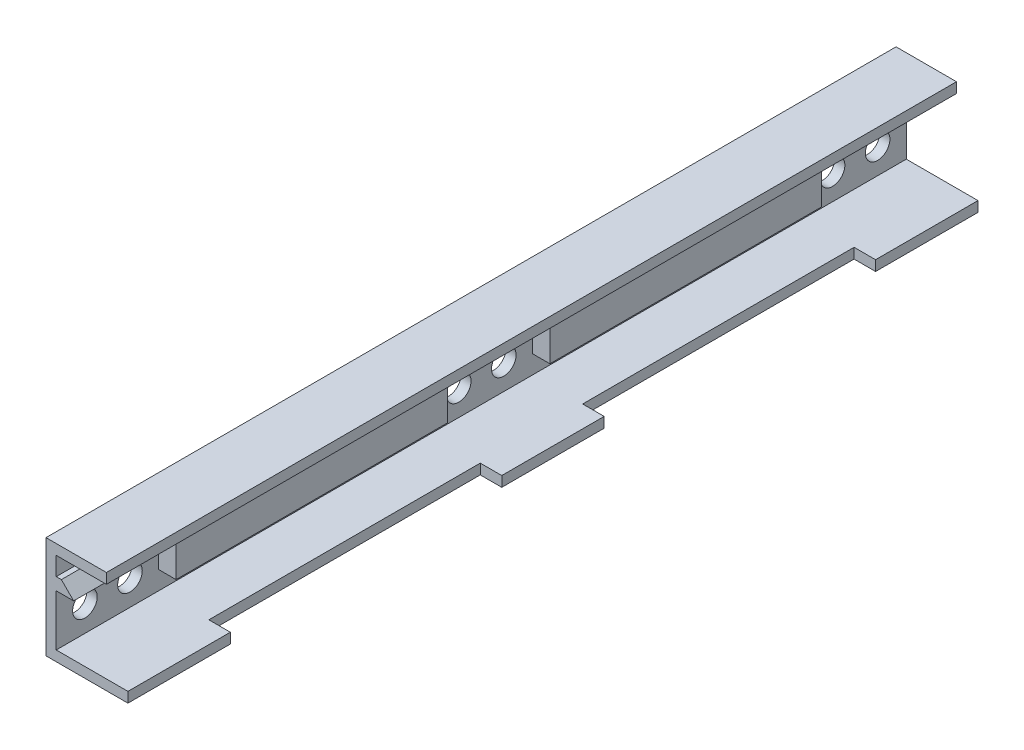
ISO-10303-21;
HEADER;
FILE_DESCRIPTION(('STEP AP214'),'2;1');
FILE_NAME('part.step','',(''),(''),'','','');
FILE_SCHEMA(('AUTOMOTIVE_DESIGN { 1 0 10303 214 1 1 1 1 }'));
ENDSEC;
DATA;
#1=APPLICATION_CONTEXT('core data for automotive mechanical design processes');
#2=APPLICATION_PROTOCOL_DEFINITION('international standard','automotive_design',2000,#1);
#3=PRODUCT_CONTEXT('',#1,'mechanical');
#4=PRODUCT('Part','Part','',(#3));
#5=PRODUCT_RELATED_PRODUCT_CATEGORY('part','',(#4));
#6=PRODUCT_DEFINITION_FORMATION('','',#4);
#7=PRODUCT_DEFINITION_CONTEXT('part definition',#1,'design');
#8=PRODUCT_DEFINITION('design','',#6,#7);
#9=PRODUCT_DEFINITION_SHAPE('','',#8);
#10=(LENGTH_UNIT() NAMED_UNIT(*) SI_UNIT(.MILLI.,.METRE.));
#11=(NAMED_UNIT(*) PLANE_ANGLE_UNIT() SI_UNIT($,.RADIAN.));
#12=(NAMED_UNIT(*) SI_UNIT($,.STERADIAN.) SOLID_ANGLE_UNIT());
#13=UNCERTAINTY_MEASURE_WITH_UNIT(LENGTH_MEASURE(1.E-05),#10,'distance_accuracy_value','');
#14=(GEOMETRIC_REPRESENTATION_CONTEXT(3) GLOBAL_UNCERTAINTY_ASSIGNED_CONTEXT((#13)) GLOBAL_UNIT_ASSIGNED_CONTEXT((#10,
#11,#12)) REPRESENTATION_CONTEXT('',''));
#15=CARTESIAN_POINT('',(0.,0.,0.));
#16=DIRECTION('',(0.,0.,1.));
#17=DIRECTION('',(1.,0.,0.));
#18=AXIS2_PLACEMENT_3D('',#15,#16,#17);
#19=CARTESIAN_POINT('',(1.,0.999999999999999,10.));
#20=DIRECTION('',(-1.,0.,0.));
#21=DIRECTION('',(0.,0.,1.));
#22=AXIS2_PLACEMENT_3D('',#19,#20,#21);
#23=PLANE('',#22);
#24=CARTESIAN_POINT('',(1.,3.5,2.8));
#25=DIRECTION('',(1.,0.,0.));
#26=DIRECTION('',(0.,0.,-1.));
#27=AXIS2_PLACEMENT_3D('',#24,#25,#26);
#28=CIRCLE('',#27,1.2);
#29=CARTESIAN_POINT('',(1.,3.5,1.6));
#30=VERTEX_POINT('',#29);
#31=EDGE_CURVE('E684',#30,#30,#28,.T.);
#32=ORIENTED_EDGE('',*,*,#31,.F.);
#33=EDGE_LOOP('',(#32));
#34=FACE_BOUND('',#33,.T.);
#35=CARTESIAN_POINT('',(1.,3.5,7.2));
#36=DIRECTION('',(1.,0.,0.));
#37=DIRECTION('',(0.,0.,-1.));
#38=AXIS2_PLACEMENT_3D('',#35,#36,#37);
#39=CIRCLE('',#38,1.2);
#40=CARTESIAN_POINT('',(1.,3.5,6.));
#41=VERTEX_POINT('',#40);
#42=EDGE_CURVE('E678',#41,#41,#39,.T.);
#43=ORIENTED_EDGE('',*,*,#42,.F.);
#44=EDGE_LOOP('',(#43));
#45=FACE_BOUND('',#44,.T.);
#46=CARTESIAN_POINT('',(1.,3.49999999999999,39.3));
#47=DIRECTION('',(1.,0.,0.));
#48=DIRECTION('',(0.,0.,-1.));
#49=AXIS2_PLACEMENT_3D('',#46,#47,#48);
#50=CIRCLE('',#49,1.2);
#51=CARTESIAN_POINT('',(1.,3.49999999999999,38.1));
#52=VERTEX_POINT('',#51);
#53=EDGE_CURVE('E672',#52,#52,#50,.T.);
#54=ORIENTED_EDGE('',*,*,#53,.F.);
#55=EDGE_LOOP('',(#54));
#56=FACE_BOUND('',#55,.T.);
#57=CARTESIAN_POINT('',(1.,3.49999999999999,75.8));
#58=DIRECTION('',(1.,0.,0.));
#59=DIRECTION('',(0.,0.,-1.));
#60=AXIS2_PLACEMENT_3D('',#57,#58,#59);
#61=CIRCLE('',#60,1.2);
#62=CARTESIAN_POINT('',(1.,3.49999999999999,74.6));
#63=VERTEX_POINT('',#62);
#64=EDGE_CURVE('E658',#63,#63,#61,.T.);
#65=ORIENTED_EDGE('',*,*,#64,.F.);
#66=EDGE_LOOP('',(#65));
#67=FACE_BOUND('',#66,.T.);
#68=CARTESIAN_POINT('',(1.,3.49999999999999,80.2));
#69=DIRECTION('',(1.,0.,0.));
#70=DIRECTION('',(0.,0.,-1.));
#71=AXIS2_PLACEMENT_3D('',#68,#69,#70);
#72=CIRCLE('',#71,1.2);
#73=CARTESIAN_POINT('',(1.,3.49999999999999,79.));
#74=VERTEX_POINT('',#73);
#75=EDGE_CURVE('E652',#74,#74,#72,.T.);
#76=ORIENTED_EDGE('',*,*,#75,.F.);
#77=EDGE_LOOP('',(#76));
#78=FACE_BOUND('',#77,.T.);
#79=DIRECTION('',(0.,1.,0.));
#80=VECTOR('',#79,1.);
#81=CARTESIAN_POINT('',(1.,0.999999999999999,0.));
#82=LINE('',#81,#80);
#83=CARTESIAN_POINT('',(1.,0.999999999999999,0.));
#84=VERTEX_POINT('',#83);
#85=CARTESIAN_POINT('',(1.,6.,0.));
#86=VERTEX_POINT('',#85);
#87=EDGE_CURVE('E477',#84,#86,#82,.T.);
#88=ORIENTED_EDGE('',*,*,#87,.T.);
#89=DIRECTION('',(0.,0.,-1.));
#90=VECTOR('',#89,1.);
#91=CARTESIAN_POINT('',(1.,6.,10.));
#92=LINE('',#91,#90);
#93=CARTESIAN_POINT('',(1.,6.,10.));
#94=VERTEX_POINT('',#93);
#95=EDGE_CURVE('E526',#94,#86,#92,.T.);
#96=ORIENTED_EDGE('',*,*,#95,.F.);
#97=DIRECTION('',(0.,1.,0.));
#98=VECTOR('',#97,1.);
#99=CARTESIAN_POINT('',(1.,0.999999999999999,10.));
#100=LINE('',#99,#98);
#101=CARTESIAN_POINT('',(1.,2.8,10.));
#102=VERTEX_POINT('',#101);
#103=EDGE_CURVE('E457',#102,#94,#100,.T.);
#104=ORIENTED_EDGE('',*,*,#103,.F.);
#105=DIRECTION('',(0.,0.,-1.));
#106=VECTOR('',#105,1.);
#107=CARTESIAN_POINT('',(0.999999999999999,2.8,36.5));
#108=LINE('',#107,#106);
#109=CARTESIAN_POINT('',(0.999999999999999,2.8,36.5));
#110=VERTEX_POINT('',#109);
#111=EDGE_CURVE('E435',#110,#102,#108,.T.);
#112=ORIENTED_EDGE('',*,*,#111,.F.);
#113=DIRECTION('',(0.,1.,0.));
#114=VECTOR('',#113,1.);
#115=CARTESIAN_POINT('',(1.00000000000003,6.,36.5));
#116=LINE('',#115,#114);
#117=CARTESIAN_POINT('',(1.00000000000003,6.,36.5));
#118=VERTEX_POINT('',#117);
#119=EDGE_CURVE('E49',#110,#118,#116,.T.);
#120=ORIENTED_EDGE('',*,*,#119,.T.);
#121=DIRECTION('',(0.,0.,-1.));
#122=VECTOR('',#121,1.);
#123=CARTESIAN_POINT('',(1.00000000000003,6.,46.5));
#124=LINE('',#123,#122);
#125=CARTESIAN_POINT('',(1.00000000000003,6.,46.5));
#126=VERTEX_POINT('',#125);
#127=EDGE_CURVE('E394',#126,#118,#124,.T.);
#128=ORIENTED_EDGE('',*,*,#127,.F.);
#129=DIRECTION('',(0.,1.,0.));
#130=VECTOR('',#129,1.);
#131=CARTESIAN_POINT('',(1.00000000000003,6.,46.5));
#132=LINE('',#131,#130);
#133=CARTESIAN_POINT('',(1.00000000000001,2.8,46.5));
#134=VERTEX_POINT('',#133);
#135=EDGE_CURVE('E57',#134,#126,#132,.T.);
#136=ORIENTED_EDGE('',*,*,#135,.F.);
#137=DIRECTION('',(0.,0.,-1.));
#138=VECTOR('',#137,1.);
#139=CARTESIAN_POINT('',(1.,2.8,73.));
#140=LINE('',#139,#138);
#141=CARTESIAN_POINT('',(1.,2.8,73.));
#142=VERTEX_POINT('',#141);
#143=EDGE_CURVE('E347',#142,#134,#140,.T.);
#144=ORIENTED_EDGE('',*,*,#143,.F.);
#145=DIRECTION('',(0.,1.,0.));
#146=VECTOR('',#145,1.);
#147=CARTESIAN_POINT('',(1.00000000000002,6.,73.));
#148=LINE('',#147,#146);
#149=CARTESIAN_POINT('',(1.00000000000002,6.,73.));
#150=VERTEX_POINT('',#149);
#151=EDGE_CURVE('E11',#142,#150,#148,.T.);
#152=ORIENTED_EDGE('',*,*,#151,.T.);
#153=DIRECTION('',(0.,0.,-1.));
#154=VECTOR('',#153,1.);
#155=CARTESIAN_POINT('',(1.00000000000002,6.,83.));
#156=LINE('',#155,#154);
#157=CARTESIAN_POINT('',(1.00000000000002,6.,83.));
#158=VERTEX_POINT('',#157);
#159=EDGE_CURVE('E310',#158,#150,#156,.T.);
#160=ORIENTED_EDGE('',*,*,#159,.F.);
#161=DIRECTION('',(0.,1.,0.));
#162=VECTOR('',#161,1.);
#163=CARTESIAN_POINT('',(1.00000000000002,6.,83.));
#164=LINE('',#163,#162);
#165=CARTESIAN_POINT('',(0.999999999999999,0.999999999999999,83.));
#166=VERTEX_POINT('',#165);
#167=EDGE_CURVE('E270',#166,#158,#164,.T.);
#168=ORIENTED_EDGE('',*,*,#167,.F.);
#169=DIRECTION('',(0.,0.,-1.));
#170=VECTOR('',#169,1.);
#171=CARTESIAN_POINT('',(1.,0.999999999999999,10.));
#172=LINE('',#171,#170);
#173=EDGE_CURVE('E530',#166,#84,#172,.T.);
#174=ORIENTED_EDGE('',*,*,#173,.T.);
#175=EDGE_LOOP('',(#88,#96,#104,#112,#120,#128,#136,#144,#152,#160,#168,#174));
#176=FACE_BOUND('',#175,.T.);
#177=CARTESIAN_POINT('',(1.,3.49999999999999,43.7));
#178=DIRECTION('',(1.,0.,0.));
#179=DIRECTION('',(0.,0.,-1.));
#180=AXIS2_PLACEMENT_3D('',#177,#178,#179);
#181=CIRCLE('',#180,1.2);
#182=CARTESIAN_POINT('',(1.,3.49999999999999,42.5));
#183=VERTEX_POINT('',#182);
#184=EDGE_CURVE('E666',#183,#183,#181,.T.);
#185=ORIENTED_EDGE('',*,*,#184,.F.);
#186=EDGE_LOOP('',(#185));
#187=FACE_BOUND('',#186,.T.);
#188=ADVANCED_FACE('F39',(#34,#45,#56,#67,#78,#176,#187),#23,.F.);
#189=CARTESIAN_POINT('',(0.,0.,73.));
#190=DIRECTION('',(0.,0.,-1.));
#191=DIRECTION('',(-1.,0.,0.));
#192=AXIS2_PLACEMENT_3D('',#189,#190,#191);
#193=PLANE('',#192);
#194=DIRECTION('',(1.,0.,0.));
#195=VECTOR('',#194,1.);
#196=CARTESIAN_POINT('',(2.70000000000003,6.,73.));
#197=LINE('',#196,#195);
#198=CARTESIAN_POINT('',(2.70000000000003,6.,73.));
#199=VERTEX_POINT('',#198);
#200=EDGE_CURVE('E254',#150,#199,#197,.T.);
#201=ORIENTED_EDGE('',*,*,#200,.F.);
#202=ORIENTED_EDGE('',*,*,#151,.F.);
#203=DIRECTION('',(1.,0.,0.));
#204=VECTOR('',#203,1.);
#205=CARTESIAN_POINT('',(2.70000000000003,2.8,73.));
#206=LINE('',#205,#204);
#207=CARTESIAN_POINT('',(2.70000000000003,2.8,73.));
#208=VERTEX_POINT('',#207);
#209=EDGE_CURVE('E324',#142,#208,#206,.T.);
#210=ORIENTED_EDGE('',*,*,#209,.T.);
#211=DIRECTION('',(0.,1.,0.));
#212=VECTOR('',#211,1.);
#213=CARTESIAN_POINT('',(2.70000000000003,6.,73.));
#214=LINE('',#213,#212);
#215=EDGE_CURVE('E328',#208,#199,#214,.T.);
#216=ORIENTED_EDGE('',*,*,#215,.T.);
#217=EDGE_LOOP('',(#201,#202,#210,#216));
#218=FACE_BOUND('',#217,.T.);
#219=ADVANCED_FACE('F603',(#218),#193,.F.);
#220=CARTESIAN_POINT('',(0.,0.,46.5));
#221=DIRECTION('',(0.,0.,-1.));
#222=DIRECTION('',(-1.,0.,0.));
#223=AXIS2_PLACEMENT_3D('',#220,#221,#222);
#224=PLANE('',#223);
#225=DIRECTION('',(0.,1.,0.));
#226=VECTOR('',#225,1.);
#227=CARTESIAN_POINT('',(5.9,0.,46.5));
#228=LINE('',#227,#226);
#229=CARTESIAN_POINT('',(5.9,0.,46.5));
#230=VERTEX_POINT('',#229);
#231=CARTESIAN_POINT('',(5.9,0.999999999999999,46.5));
#232=VERTEX_POINT('',#231);
#233=EDGE_CURVE('E65',#230,#232,#228,.T.);
#234=ORIENTED_EDGE('',*,*,#233,.F.);
#235=DIRECTION('',(1.,0.,0.));
#236=VECTOR('',#235,1.);
#237=CARTESIAN_POINT('',(0.,0.,46.5));
#238=LINE('',#237,#236);
#239=CARTESIAN_POINT('',(8.,0.,46.5));
#240=VERTEX_POINT('',#239);
#241=EDGE_CURVE('E359',#230,#240,#238,.T.);
#242=ORIENTED_EDGE('',*,*,#241,.T.);
#243=DIRECTION('',(0.,1.,0.));
#244=VECTOR('',#243,1.);
#245=CARTESIAN_POINT('',(8.,0.999999999999999,46.5));
#246=LINE('',#245,#244);
#247=CARTESIAN_POINT('',(8.,0.999999999999999,46.5));
#248=VERTEX_POINT('',#247);
#249=EDGE_CURVE('E362',#240,#248,#246,.T.);
#250=ORIENTED_EDGE('',*,*,#249,.T.);
#251=DIRECTION('',(-1.,0.,0.));
#252=VECTOR('',#251,1.);
#253=CARTESIAN_POINT('',(0.999999999999999,0.999999999999999,46.5));
#254=LINE('',#253,#252);
#255=EDGE_CURVE('E366',#248,#232,#254,.T.);
#256=ORIENTED_EDGE('',*,*,#255,.T.);
#257=EDGE_LOOP('',(#234,#242,#250,#256));
#258=FACE_BOUND('',#257,.T.);
#259=ADVANCED_FACE('F573',(#258),#224,.F.);
#260=CARTESIAN_POINT('',(0.,10.,10.));
#261=DIRECTION('',(1.,0.,0.));
#262=DIRECTION('',(0.,0.,-1.));
#263=AXIS2_PLACEMENT_3D('',#260,#261,#262);
#264=PLANE('',#263);
#265=CARTESIAN_POINT('',(0.,3.5,2.8));
#266=DIRECTION('',(1.,0.,0.));
#267=DIRECTION('',(0.,0.,-1.));
#268=AXIS2_PLACEMENT_3D('',#265,#266,#267);
#269=CIRCLE('',#268,1.2);
#270=CARTESIAN_POINT('',(0.,3.5,1.6));
#271=VERTEX_POINT('',#270);
#272=EDGE_CURVE('E631',#271,#271,#269,.T.);
#273=ORIENTED_EDGE('',*,*,#272,.T.);
#274=EDGE_LOOP('',(#273));
#275=FACE_BOUND('',#274,.T.);
#276=CARTESIAN_POINT('',(0.,3.5,7.2));
#277=DIRECTION('',(1.,0.,0.));
#278=DIRECTION('',(0.,0.,-1.));
#279=AXIS2_PLACEMENT_3D('',#276,#277,#278);
#280=CIRCLE('',#279,1.2);
#281=CARTESIAN_POINT('',(0.,3.5,6.));
#282=VERTEX_POINT('',#281);
#283=EDGE_CURVE('E635',#282,#282,#280,.T.);
#284=ORIENTED_EDGE('',*,*,#283,.T.);
#285=EDGE_LOOP('',(#284));
#286=FACE_BOUND('',#285,.T.);
#287=CARTESIAN_POINT('',(0.,3.49999999999999,39.3));
#288=DIRECTION('',(1.,0.,0.));
#289=DIRECTION('',(0.,0.,-1.));
#290=AXIS2_PLACEMENT_3D('',#287,#288,#289);
#291=CIRCLE('',#290,1.2);
#292=CARTESIAN_POINT('',(0.,3.49999999999999,38.1));
#293=VERTEX_POINT('',#292);
#294=EDGE_CURVE('E639',#293,#293,#291,.T.);
#295=ORIENTED_EDGE('',*,*,#294,.T.);
#296=EDGE_LOOP('',(#295));
#297=FACE_BOUND('',#296,.T.);
#298=CARTESIAN_POINT('',(0.,3.49999999999999,43.7));
#299=DIRECTION('',(1.,0.,0.));
#300=DIRECTION('',(0.,0.,-1.));
#301=AXIS2_PLACEMENT_3D('',#298,#299,#300);
#302=CIRCLE('',#301,1.2);
#303=CARTESIAN_POINT('',(0.,3.49999999999999,42.5));
#304=VERTEX_POINT('',#303);
#305=EDGE_CURVE('E643',#304,#304,#302,.T.);
#306=ORIENTED_EDGE('',*,*,#305,.T.);
#307=EDGE_LOOP('',(#306));
#308=FACE_BOUND('',#307,.T.);
#309=CARTESIAN_POINT('',(0.,3.49999999999999,75.8));
#310=DIRECTION('',(1.,0.,0.));
#311=DIRECTION('',(0.,0.,-1.));
#312=AXIS2_PLACEMENT_3D('',#309,#310,#311);
#313=CIRCLE('',#312,1.2);
#314=CARTESIAN_POINT('',(0.,3.49999999999999,74.6));
#315=VERTEX_POINT('',#314);
#316=EDGE_CURVE('E647',#315,#315,#313,.T.);
#317=ORIENTED_EDGE('',*,*,#316,.T.);
#318=EDGE_LOOP('',(#317));
#319=FACE_BOUND('',#318,.T.);
#320=CARTESIAN_POINT('',(0.,3.49999999999999,80.2));
#321=DIRECTION('',(1.,0.,0.));
#322=DIRECTION('',(0.,0.,-1.));
#323=AXIS2_PLACEMENT_3D('',#320,#321,#322);
#324=CIRCLE('',#323,1.2);
#325=CARTESIAN_POINT('',(0.,3.49999999999999,79.));
#326=VERTEX_POINT('',#325);
#327=EDGE_CURVE('E261',#326,#326,#324,.T.);
#328=ORIENTED_EDGE('',*,*,#327,.T.);
#329=EDGE_LOOP('',(#328));
#330=FACE_BOUND('',#329,.T.);
#331=DIRECTION('',(0.,-1.,0.));
#332=VECTOR('',#331,1.);
#333=CARTESIAN_POINT('',(0.,10.,0.));
#334=LINE('',#333,#332);
#335=CARTESIAN_POINT('',(0.,10.,0.));
#336=VERTEX_POINT('',#335);
#337=CARTESIAN_POINT('',(0.,0.,0.));
#338=VERTEX_POINT('',#337);
#339=EDGE_CURVE('E234',#336,#338,#334,.T.);
#340=ORIENTED_EDGE('',*,*,#339,.T.);
#341=DIRECTION('',(0.,0.,-1.));
#342=VECTOR('',#341,1.);
#343=CARTESIAN_POINT('',(0.,0.,10.));
#344=LINE('',#343,#342);
#345=CARTESIAN_POINT('',(0.,0.,83.));
#346=VERTEX_POINT('',#345);
#347=EDGE_CURVE('E43',#346,#338,#344,.T.);
#348=ORIENTED_EDGE('',*,*,#347,.F.);
#349=DIRECTION('',(0.,-1.,0.));
#350=VECTOR('',#349,1.);
#351=CARTESIAN_POINT('',(0.,0.,83.));
#352=LINE('',#351,#350);
#353=CARTESIAN_POINT('',(0.,10.,83.));
#354=VERTEX_POINT('',#353);
#355=EDGE_CURVE('E232',#354,#346,#352,.T.);
#356=ORIENTED_EDGE('',*,*,#355,.F.);
#357=DIRECTION('',(0.,0.,-1.));
#358=VECTOR('',#357,1.);
#359=CARTESIAN_POINT('',(0.,10.,10.));
#360=LINE('',#359,#358);
#361=EDGE_CURVE('E465',#354,#336,#360,.T.);
#362=ORIENTED_EDGE('',*,*,#361,.T.);
#363=EDGE_LOOP('',(#340,#348,#356,#362));
#364=FACE_BOUND('',#363,.T.);
#365=ADVANCED_FACE('F41',(#275,#286,#297,#308,#319,#330,#364),#264,.F.);
#366=CARTESIAN_POINT('',(0.,0.,10.));
#367=DIRECTION('',(0.,1.,0.));
#368=DIRECTION('',(0.,0.,1.));
#369=AXIS2_PLACEMENT_3D('',#366,#367,#368);
#370=PLANE('',#369);
#371=DIRECTION('',(1.,0.,0.));
#372=VECTOR('',#371,1.);
#373=CARTESIAN_POINT('',(0.,0.,0.));
#374=LINE('',#373,#372);
#375=CARTESIAN_POINT('',(8.,0.,0.));
#376=VERTEX_POINT('',#375);
#377=EDGE_CURVE('E468',#338,#376,#374,.T.);
#378=ORIENTED_EDGE('',*,*,#377,.T.);
#379=DIRECTION('',(0.,0.,-1.));
#380=VECTOR('',#379,1.);
#381=CARTESIAN_POINT('',(8.,0.,10.));
#382=LINE('',#381,#380);
#383=CARTESIAN_POINT('',(8.,0.,10.));
#384=VERTEX_POINT('',#383);
#385=EDGE_CURVE('E237',#384,#376,#382,.T.);
#386=ORIENTED_EDGE('',*,*,#385,.F.);
#387=DIRECTION('',(1.,0.,0.));
#388=VECTOR('',#387,1.);
#389=CARTESIAN_POINT('',(0.,0.,10.));
#390=LINE('',#389,#388);
#391=CARTESIAN_POINT('',(5.9,0.,10.));
#392=VERTEX_POINT('',#391);
#393=EDGE_CURVE('E447',#392,#384,#390,.T.);
#394=ORIENTED_EDGE('',*,*,#393,.F.);
#395=DIRECTION('',(0.,0.,-1.));
#396=VECTOR('',#395,1.);
#397=CARTESIAN_POINT('',(5.9,0.,36.5));
#398=LINE('',#397,#396);
#399=CARTESIAN_POINT('',(5.9,0.,36.5));
#400=VERTEX_POINT('',#399);
#401=EDGE_CURVE('E443',#400,#392,#398,.T.);
#402=ORIENTED_EDGE('',*,*,#401,.F.);
#403=DIRECTION('',(1.,0.,0.));
#404=VECTOR('',#403,1.);
#405=CARTESIAN_POINT('',(0.,0.,36.5));
#406=LINE('',#405,#404);
#407=CARTESIAN_POINT('',(8.,0.,36.5));
#408=VERTEX_POINT('',#407);
#409=EDGE_CURVE('E358',#400,#408,#406,.T.);
#410=ORIENTED_EDGE('',*,*,#409,.T.);
#411=DIRECTION('',(0.,0.,-1.));
#412=VECTOR('',#411,1.);
#413=CARTESIAN_POINT('',(8.,0.,46.5));
#414=LINE('',#413,#412);
#415=EDGE_CURVE('E402',#240,#408,#414,.T.);
#416=ORIENTED_EDGE('',*,*,#415,.F.);
#417=ORIENTED_EDGE('',*,*,#241,.F.);
#418=DIRECTION('',(0.,0.,-1.));
#419=VECTOR('',#418,1.);
#420=CARTESIAN_POINT('',(5.9,0.,73.));
#421=LINE('',#420,#419);
#422=CARTESIAN_POINT('',(5.9,0.,73.));
#423=VERTEX_POINT('',#422);
#424=EDGE_CURVE('E354',#423,#230,#421,.T.);
#425=ORIENTED_EDGE('',*,*,#424,.F.);
#426=DIRECTION('',(1.,0.,0.));
#427=VECTOR('',#426,1.);
#428=CARTESIAN_POINT('',(0.,0.,73.));
#429=LINE('',#428,#427);
#430=CARTESIAN_POINT('',(8.,0.,73.));
#431=VERTEX_POINT('',#430);
#432=EDGE_CURVE('E298',#423,#431,#429,.T.);
#433=ORIENTED_EDGE('',*,*,#432,.T.);
#434=DIRECTION('',(0.,0.,-1.));
#435=VECTOR('',#434,1.);
#436=CARTESIAN_POINT('',(8.,0.,83.));
#437=LINE('',#436,#435);
#438=CARTESIAN_POINT('',(8.,0.,83.));
#439=VERTEX_POINT('',#438);
#440=EDGE_CURVE('E242',#439,#431,#437,.T.);
#441=ORIENTED_EDGE('',*,*,#440,.F.);
#442=DIRECTION('',(1.,0.,0.));
#443=VECTOR('',#442,1.);
#444=CARTESIAN_POINT('',(0.,0.,83.));
#445=LINE('',#444,#443);
#446=EDGE_CURVE('E239',#346,#439,#445,.T.);
#447=ORIENTED_EDGE('',*,*,#446,.F.);
#448=ORIENTED_EDGE('',*,*,#347,.T.);
#449=EDGE_LOOP('',(#378,#386,#394,#402,#410,#416,#417,#425,#433,#441,#447,#448));
#450=FACE_BOUND('',#449,.T.);
#451=ADVANCED_FACE('F240',(#450),#370,.F.);
#452=CARTESIAN_POINT('',(8.,0.,10.));
#453=DIRECTION('',(-1.,0.,0.));
#454=DIRECTION('',(0.,0.,1.));
#455=AXIS2_PLACEMENT_3D('',#452,#453,#454);
#456=PLANE('',#455);
#457=DIRECTION('',(0.,1.,0.));
#458=VECTOR('',#457,1.);
#459=CARTESIAN_POINT('',(8.,0.,0.));
#460=LINE('',#459,#458);
#461=CARTESIAN_POINT('',(8.,1.,0.));
#462=VERTEX_POINT('',#461);
#463=EDGE_CURVE('E471',#376,#462,#460,.T.);
#464=ORIENTED_EDGE('',*,*,#463,.T.);
#465=DIRECTION('',(0.,0.,-1.));
#466=VECTOR('',#465,1.);
#467=CARTESIAN_POINT('',(8.,1.,10.));
#468=LINE('',#467,#466);
#469=CARTESIAN_POINT('',(8.,1.,10.));
#470=VERTEX_POINT('',#469);
#471=EDGE_CURVE('E534',#470,#462,#468,.T.);
#472=ORIENTED_EDGE('',*,*,#471,.F.);
#473=DIRECTION('',(0.,1.,0.));
#474=VECTOR('',#473,1.);
#475=CARTESIAN_POINT('',(8.,0.,10.));
#476=LINE('',#475,#474);
#477=EDGE_CURVE('E450',#384,#470,#476,.T.);
#478=ORIENTED_EDGE('',*,*,#477,.F.);
#479=ORIENTED_EDGE('',*,*,#385,.T.);
#480=EDGE_LOOP('',(#464,#472,#478,#479));
#481=FACE_BOUND('',#480,.T.);
#482=ADVANCED_FACE('F543',(#481),#456,.F.);
#483=CARTESIAN_POINT('',(8.,1.,10.));
#484=DIRECTION('',(0.,-1.,0.));
#485=DIRECTION('',(1.,0.,0.));
#486=AXIS2_PLACEMENT_3D('',#483,#484,#485);
#487=PLANE('',#486);
#488=DIRECTION('',(-1.,0.,0.));
#489=VECTOR('',#488,1.);
#490=CARTESIAN_POINT('',(8.,1.,0.));
#491=LINE('',#490,#489);
#492=EDGE_CURVE('E474',#462,#84,#491,.T.);
#493=ORIENTED_EDGE('',*,*,#492,.T.);
#494=ORIENTED_EDGE('',*,*,#173,.F.);
#495=DIRECTION('',(-1.,0.,0.));
#496=VECTOR('',#495,1.);
#497=CARTESIAN_POINT('',(0.999999999999999,0.999999999999999,83.));
#498=LINE('',#497,#496);
#499=CARTESIAN_POINT('',(8.,0.999999999999999,83.));
#500=VERTEX_POINT('',#499);
#501=EDGE_CURVE('E266',#500,#166,#498,.T.);
#502=ORIENTED_EDGE('',*,*,#501,.F.);
#503=DIRECTION('',(0.,0.,-1.));
#504=VECTOR('',#503,1.);
#505=CARTESIAN_POINT('',(8.,0.999999999999999,83.));
#506=LINE('',#505,#504);
#507=CARTESIAN_POINT('',(8.,0.999999999999999,73.));
#508=VERTEX_POINT('',#507);
#509=EDGE_CURVE('E314',#500,#508,#506,.T.);
#510=ORIENTED_EDGE('',*,*,#509,.T.);
#511=DIRECTION('',(-1.,0.,0.));
#512=VECTOR('',#511,1.);
#513=CARTESIAN_POINT('',(0.999999999999999,0.999999999999999,73.));
#514=LINE('',#513,#512);
#515=CARTESIAN_POINT('',(5.9,0.999999999999999,73.));
#516=VERTEX_POINT('',#515);
#517=EDGE_CURVE('E258',#508,#516,#514,.T.);
#518=ORIENTED_EDGE('',*,*,#517,.T.);
#519=DIRECTION('',(0.,0.,-1.));
#520=VECTOR('',#519,1.);
#521=CARTESIAN_POINT('',(5.9,0.999999999999999,73.));
#522=LINE('',#521,#520);
#523=EDGE_CURVE('E350',#516,#232,#522,.T.);
#524=ORIENTED_EDGE('',*,*,#523,.T.);
#525=ORIENTED_EDGE('',*,*,#255,.F.);
#526=DIRECTION('',(0.,0.,-1.));
#527=VECTOR('',#526,1.);
#528=CARTESIAN_POINT('',(8.,0.999999999999999,46.5));
#529=LINE('',#528,#527);
#530=CARTESIAN_POINT('',(8.,0.999999999999999,36.5));
#531=VERTEX_POINT('',#530);
#532=EDGE_CURVE('E398',#248,#531,#529,.T.);
#533=ORIENTED_EDGE('',*,*,#532,.T.);
#534=DIRECTION('',(-1.,0.,0.));
#535=VECTOR('',#534,1.);
#536=CARTESIAN_POINT('',(0.999999999999999,0.999999999999999,36.5));
#537=LINE('',#536,#535);
#538=CARTESIAN_POINT('',(5.9,1.,36.5));
#539=VERTEX_POINT('',#538);
#540=EDGE_CURVE('E381',#531,#539,#537,.T.);
#541=ORIENTED_EDGE('',*,*,#540,.T.);
#542=DIRECTION('',(0.,0.,-1.));
#543=VECTOR('',#542,1.);
#544=CARTESIAN_POINT('',(5.9,1.,36.5));
#545=LINE('',#544,#543);
#546=CARTESIAN_POINT('',(5.9,1.,10.));
#547=VERTEX_POINT('',#546);
#548=EDGE_CURVE('E439',#539,#547,#545,.T.);
#549=ORIENTED_EDGE('',*,*,#548,.T.);
#550=DIRECTION('',(-1.,0.,0.));
#551=VECTOR('',#550,1.);
#552=CARTESIAN_POINT('',(8.,1.,10.));
#553=LINE('',#552,#551);
#554=EDGE_CURVE('E454',#470,#547,#553,.T.);
#555=ORIENTED_EDGE('',*,*,#554,.F.);
#556=ORIENTED_EDGE('',*,*,#471,.T.);
#557=EDGE_LOOP('',(#493,#494,#502,#510,#518,#524,#525,#533,#541,#549,#555,#556));
#558=FACE_BOUND('',#557,.T.);
#559=ADVANCED_FACE('F552',(#558),#487,.F.);
#560=CARTESIAN_POINT('',(1.,6.,10.));
#561=DIRECTION('',(0.,1.,0.));
#562=DIRECTION('',(0.,0.,1.));
#563=AXIS2_PLACEMENT_3D('',#560,#561,#562);
#564=PLANE('',#563);
#565=DIRECTION('',(1.,0.,0.));
#566=VECTOR('',#565,1.);
#567=CARTESIAN_POINT('',(1.,6.,0.));
#568=LINE('',#567,#566);
#569=CARTESIAN_POINT('',(2.70000000000002,6.,0.));
#570=VERTEX_POINT('',#569);
#571=EDGE_CURVE('E480',#86,#570,#568,.T.);
#572=ORIENTED_EDGE('',*,*,#571,.T.);
#573=DIRECTION('',(0.,0.,-1.));
#574=VECTOR('',#573,1.);
#575=CARTESIAN_POINT('',(2.70000000000002,6.,10.));
#576=LINE('',#575,#574);
#577=CARTESIAN_POINT('',(2.70000000000002,6.,10.));
#578=VERTEX_POINT('',#577);
#579=EDGE_CURVE('E522',#578,#570,#576,.T.);
#580=ORIENTED_EDGE('',*,*,#579,.F.);
#581=DIRECTION('',(1.,0.,0.));
#582=VECTOR('',#581,1.);
#583=CARTESIAN_POINT('',(1.,6.,10.));
#584=LINE('',#583,#582);
#585=EDGE_CURVE('E461',#94,#578,#584,.T.);
#586=ORIENTED_EDGE('',*,*,#585,.F.);
#587=ORIENTED_EDGE('',*,*,#95,.T.);
#588=EDGE_LOOP('',(#572,#580,#586,#587));
#589=FACE_BOUND('',#588,.T.);
#590=ADVANCED_FACE('F614',(#589),#564,.F.);
#591=CARTESIAN_POINT('',(2.70000000000002,6.,10.));
#592=DIRECTION('',(-0.707106781186548,-0.707106781186547,0.));
#593=DIRECTION('',(0.707106781186547,-0.707106781186548,0.));
#594=AXIS2_PLACEMENT_3D('',#591,#592,#593);
#595=PLANE('',#594);
#596=DIRECTION('',(-0.707106781186547,0.707106781186548,0.));
#597=VECTOR('',#596,1.);
#598=CARTESIAN_POINT('',(2.70000000000002,6.,0.));
#599=LINE('',#598,#597);
#600=CARTESIAN_POINT('',(1.50000000000002,7.2,0.));
#601=VERTEX_POINT('',#600);
#602=EDGE_CURVE('E483',#570,#601,#599,.T.);
#603=ORIENTED_EDGE('',*,*,#602,.T.);
#604=DIRECTION('',(0.,0.,-1.));
#605=VECTOR('',#604,1.);
#606=CARTESIAN_POINT('',(1.50000000000002,7.2,10.));
#607=LINE('',#606,#605);
#608=CARTESIAN_POINT('',(1.50000000000002,7.2,83.));
#609=VERTEX_POINT('',#608);
#610=EDGE_CURVE('E518',#609,#601,#607,.T.);
#611=ORIENTED_EDGE('',*,*,#610,.F.);
#612=DIRECTION('',(-0.707106781186547,0.707106781186548,0.));
#613=VECTOR('',#612,1.);
#614=CARTESIAN_POINT('',(2.70000000000003,6.,83.));
#615=LINE('',#614,#613);
#616=CARTESIAN_POINT('',(2.70000000000003,6.,83.));
#617=VERTEX_POINT('',#616);
#618=EDGE_CURVE('E276',#617,#609,#615,.T.);
#619=ORIENTED_EDGE('',*,*,#618,.F.);
#620=DIRECTION('',(0.,0.,-1.));
#621=VECTOR('',#620,1.);
#622=CARTESIAN_POINT('',(2.70000000000003,6.,83.));
#623=LINE('',#622,#621);
#624=EDGE_CURVE('E297',#617,#199,#623,.T.);
#625=ORIENTED_EDGE('',*,*,#624,.T.);
#626=DIRECTION('',(0.,0.,-1.));
#627=VECTOR('',#626,1.);
#628=CARTESIAN_POINT('',(2.70000000000003,6.,73.));
#629=LINE('',#628,#627);
#630=CARTESIAN_POINT('',(2.70000000000003,6.,46.5));
#631=VERTEX_POINT('',#630);
#632=EDGE_CURVE('E331',#199,#631,#629,.T.);
#633=ORIENTED_EDGE('',*,*,#632,.T.);
#634=DIRECTION('',(0.,0.,-1.));
#635=VECTOR('',#634,1.);
#636=CARTESIAN_POINT('',(2.70000000000003,6.,46.5));
#637=LINE('',#636,#635);
#638=CARTESIAN_POINT('',(2.70000000000003,6.,36.5));
#639=VERTEX_POINT('',#638);
#640=EDGE_CURVE('E375',#631,#639,#637,.T.);
#641=ORIENTED_EDGE('',*,*,#640,.T.);
#642=DIRECTION('',(0.,0.,-1.));
#643=VECTOR('',#642,1.);
#644=CARTESIAN_POINT('',(2.70000000000003,6.,36.5));
#645=LINE('',#644,#643);
#646=EDGE_CURVE('E418',#639,#578,#645,.T.);
#647=ORIENTED_EDGE('',*,*,#646,.T.);
#648=ORIENTED_EDGE('',*,*,#579,.T.);
#649=EDGE_LOOP('',(#603,#611,#619,#625,#633,#641,#647,#648));
#650=FACE_BOUND('',#649,.T.);
#651=ADVANCED_FACE('F799',(#650),#595,.F.);
#652=CARTESIAN_POINT('',(1.50000000000002,7.2,10.));
#653=DIRECTION('',(0.,-1.,0.));
#654=DIRECTION('',(0.,0.,-1.));
#655=AXIS2_PLACEMENT_3D('',#652,#653,#654);
#656=PLANE('',#655);
#657=DIRECTION('',(-1.,0.,0.));
#658=VECTOR('',#657,1.);
#659=CARTESIAN_POINT('',(1.50000000000002,7.2,0.));
#660=LINE('',#659,#658);
#661=CARTESIAN_POINT('',(1.00000000000002,7.2,0.));
#662=VERTEX_POINT('',#661);
#663=EDGE_CURVE('E486',#601,#662,#660,.T.);
#664=ORIENTED_EDGE('',*,*,#663,.T.);
#665=DIRECTION('',(0.,0.,-1.));
#666=VECTOR('',#665,1.);
#667=CARTESIAN_POINT('',(1.00000000000002,7.2,10.));
#668=LINE('',#667,#666);
#669=CARTESIAN_POINT('',(1.00000000000002,7.2,83.));
#670=VERTEX_POINT('',#669);
#671=EDGE_CURVE('E514',#670,#662,#668,.T.);
#672=ORIENTED_EDGE('',*,*,#671,.F.);
#673=DIRECTION('',(-1.,0.,0.));
#674=VECTOR('',#673,1.);
#675=CARTESIAN_POINT('',(1.50000000000002,7.2,83.));
#676=LINE('',#675,#674);
#677=EDGE_CURVE('E280',#609,#670,#676,.T.);
#678=ORIENTED_EDGE('',*,*,#677,.F.);
#679=ORIENTED_EDGE('',*,*,#610,.T.);
#680=EDGE_LOOP('',(#664,#672,#678,#679));
#681=FACE_BOUND('',#680,.T.);
#682=ADVANCED_FACE('F804',(#681),#656,.F.);
#683=CARTESIAN_POINT('',(1.00000000000002,7.2,10.));
#684=DIRECTION('',(-1.,0.,0.));
#685=DIRECTION('',(0.,-1.,0.));
#686=AXIS2_PLACEMENT_3D('',#683,#684,#685);
#687=PLANE('',#686);
#688=DIRECTION('',(0.,1.,0.));
#689=VECTOR('',#688,1.);
#690=CARTESIAN_POINT('',(1.00000000000002,7.2,0.));
#691=LINE('',#690,#689);
#692=CARTESIAN_POINT('',(1.00000000000002,9.,0.));
#693=VERTEX_POINT('',#692);
#694=EDGE_CURVE('E489',#662,#693,#691,.T.);
#695=ORIENTED_EDGE('',*,*,#694,.T.);
#696=DIRECTION('',(0.,0.,-1.));
#697=VECTOR('',#696,1.);
#698=CARTESIAN_POINT('',(1.00000000000002,9.,10.));
#699=LINE('',#698,#697);
#700=CARTESIAN_POINT('',(1.00000000000002,9.,83.));
#701=VERTEX_POINT('',#700);
#702=EDGE_CURVE('E510',#701,#693,#699,.T.);
#703=ORIENTED_EDGE('',*,*,#702,.F.);
#704=DIRECTION('',(0.,1.,0.));
#705=VECTOR('',#704,1.);
#706=CARTESIAN_POINT('',(1.00000000000002,7.2,83.));
#707=LINE('',#706,#705);
#708=EDGE_CURVE('E284',#670,#701,#707,.T.);
#709=ORIENTED_EDGE('',*,*,#708,.F.);
#710=ORIENTED_EDGE('',*,*,#671,.T.);
#711=EDGE_LOOP('',(#695,#703,#709,#710));
#712=FACE_BOUND('',#711,.T.);
#713=ADVANCED_FACE('F816',(#712),#687,.F.);
#714=CARTESIAN_POINT('',(1.00000000000002,9.,10.));
#715=DIRECTION('',(0.,1.,0.));
#716=DIRECTION('',(0.,0.,1.));
#717=AXIS2_PLACEMENT_3D('',#714,#715,#716);
#718=PLANE('',#717);
#719=DIRECTION('',(1.,0.,0.));
#720=VECTOR('',#719,1.);
#721=CARTESIAN_POINT('',(1.00000000000002,9.,0.));
#722=LINE('',#721,#720);
#723=CARTESIAN_POINT('',(5.90000000000003,9.,0.));
#724=VERTEX_POINT('',#723);
#725=EDGE_CURVE('E492',#693,#724,#722,.T.);
#726=ORIENTED_EDGE('',*,*,#725,.T.);
#727=DIRECTION('',(0.,0.,-1.));
#728=VECTOR('',#727,1.);
#729=CARTESIAN_POINT('',(5.90000000000003,9.,10.));
#730=LINE('',#729,#728);
#731=CARTESIAN_POINT('',(5.9,9.,83.));
#732=VERTEX_POINT('',#731);
#733=EDGE_CURVE('E506',#732,#724,#730,.T.);
#734=ORIENTED_EDGE('',*,*,#733,.F.);
#735=DIRECTION('',(1.,0.,0.));
#736=VECTOR('',#735,1.);
#737=CARTESIAN_POINT('',(1.00000000000002,9.,83.));
#738=LINE('',#737,#736);
#739=EDGE_CURVE('E288',#701,#732,#738,.T.);
#740=ORIENTED_EDGE('',*,*,#739,.F.);
#741=ORIENTED_EDGE('',*,*,#702,.T.);
#742=EDGE_LOOP('',(#726,#734,#740,#741));
#743=FACE_BOUND('',#742,.T.);
#744=ADVANCED_FACE('F829',(#743),#718,.F.);
#745=CARTESIAN_POINT('',(5.90000000000003,9.,10.));
#746=DIRECTION('',(-1.,0.,0.));
#747=DIRECTION('',(0.,-1.,0.));
#748=AXIS2_PLACEMENT_3D('',#745,#746,#747);
#749=PLANE('',#748);
#750=DIRECTION('',(0.,1.,0.));
#751=VECTOR('',#750,1.);
#752=CARTESIAN_POINT('',(5.90000000000003,9.,0.));
#753=LINE('',#752,#751);
#754=CARTESIAN_POINT('',(5.90000000000002,10.,0.));
#755=VERTEX_POINT('',#754);
#756=EDGE_CURVE('E495',#724,#755,#753,.T.);
#757=ORIENTED_EDGE('',*,*,#756,.T.);
#758=DIRECTION('',(0.,0.,-1.));
#759=VECTOR('',#758,1.);
#760=CARTESIAN_POINT('',(5.90000000000002,10.,10.));
#761=LINE('',#760,#759);
#762=CARTESIAN_POINT('',(5.9,10.,83.));
#763=VERTEX_POINT('',#762);
#764=EDGE_CURVE('E502',#763,#755,#761,.T.);
#765=ORIENTED_EDGE('',*,*,#764,.F.);
#766=DIRECTION('',(0.,1.,0.));
#767=VECTOR('',#766,1.);
#768=CARTESIAN_POINT('',(5.9,9.,83.));
#769=LINE('',#768,#767);
#770=EDGE_CURVE('E292',#732,#763,#769,.T.);
#771=ORIENTED_EDGE('',*,*,#770,.F.);
#772=ORIENTED_EDGE('',*,*,#733,.T.);
#773=EDGE_LOOP('',(#757,#765,#771,#772));
#774=FACE_BOUND('',#773,.T.);
#775=ADVANCED_FACE('F842',(#774),#749,.F.);
#776=CARTESIAN_POINT('',(5.90000000000002,10.,10.));
#777=DIRECTION('',(0.,-1.,0.));
#778=DIRECTION('',(1.,0.,0.));
#779=AXIS2_PLACEMENT_3D('',#776,#777,#778);
#780=PLANE('',#779);
#781=DIRECTION('',(-1.,0.,0.));
#782=VECTOR('',#781,1.);
#783=CARTESIAN_POINT('',(5.90000000000002,10.,0.));
#784=LINE('',#783,#782);
#785=EDGE_CURVE('E451',#755,#336,#784,.T.);
#786=ORIENTED_EDGE('',*,*,#785,.T.);
#787=ORIENTED_EDGE('',*,*,#361,.F.);
#788=DIRECTION('',(-1.,0.,0.));
#789=VECTOR('',#788,1.);
#790=CARTESIAN_POINT('',(0.,10.,83.));
#791=LINE('',#790,#789);
#792=EDGE_CURVE('E252',#763,#354,#791,.T.);
#793=ORIENTED_EDGE('',*,*,#792,.F.);
#794=ORIENTED_EDGE('',*,*,#764,.T.);
#795=EDGE_LOOP('',(#786,#787,#793,#794));
#796=FACE_BOUND('',#795,.T.);
#797=ADVANCED_FACE('F855',(#796),#780,.F.);
#798=CARTESIAN_POINT('',(0.,0.,10.));
#799=DIRECTION('',(0.,0.,1.));
#800=DIRECTION('',(1.,0.,0.));
#801=AXIS2_PLACEMENT_3D('',#798,#799,#800);
#802=PLANE('',#801);
#803=DIRECTION('',(0.,1.,0.));
#804=VECTOR('',#803,1.);
#805=CARTESIAN_POINT('',(5.9,0.,10.));
#806=LINE('',#805,#804);
#807=EDGE_CURVE('E406',#392,#547,#806,.T.);
#808=ORIENTED_EDGE('',*,*,#807,.F.);
#809=ORIENTED_EDGE('',*,*,#393,.T.);
#810=ORIENTED_EDGE('',*,*,#477,.T.);
#811=ORIENTED_EDGE('',*,*,#554,.T.);
#812=EDGE_LOOP('',(#808,#809,#810,#811));
#813=FACE_BOUND('',#812,.T.);
#814=ADVANCED_FACE('F586',(#813),#802,.T.);
#815=CARTESIAN_POINT('',(0.,0.,0.));
#816=DIRECTION('',(0.,0.,1.));
#817=DIRECTION('',(1.,0.,0.));
#818=AXIS2_PLACEMENT_3D('',#815,#816,#817);
#819=PLANE('',#818);
#820=ORIENTED_EDGE('',*,*,#339,.F.);
#821=ORIENTED_EDGE('',*,*,#785,.F.);
#822=ORIENTED_EDGE('',*,*,#756,.F.);
#823=ORIENTED_EDGE('',*,*,#725,.F.);
#824=ORIENTED_EDGE('',*,*,#694,.F.);
#825=ORIENTED_EDGE('',*,*,#663,.F.);
#826=ORIENTED_EDGE('',*,*,#602,.F.);
#827=ORIENTED_EDGE('',*,*,#571,.F.);
#828=ORIENTED_EDGE('',*,*,#87,.F.);
#829=ORIENTED_EDGE('',*,*,#492,.F.);
#830=ORIENTED_EDGE('',*,*,#463,.F.);
#831=ORIENTED_EDGE('',*,*,#377,.F.);
#832=EDGE_LOOP('',(#820,#821,#822,#823,#824,#825,#826,#827,#828,#829,#830,#831));
#833=FACE_BOUND('',#832,.T.);
#834=ADVANCED_FACE('F548',(#833),#819,.F.);
#835=CARTESIAN_POINT('',(0.,0.,10.));
#836=DIRECTION('',(0.,0.,1.));
#837=DIRECTION('',(1.,0.,0.));
#838=AXIS2_PLACEMENT_3D('',#835,#836,#837);
#839=PLANE('',#838);
#840=DIRECTION('',(1.,0.,0.));
#841=VECTOR('',#840,1.);
#842=CARTESIAN_POINT('',(0.999999999999999,2.8,10.));
#843=LINE('',#842,#841);
#844=CARTESIAN_POINT('',(2.70000000000003,2.8,10.));
#845=VERTEX_POINT('',#844);
#846=EDGE_CURVE('E422',#102,#845,#843,.T.);
#847=ORIENTED_EDGE('',*,*,#846,.F.);
#848=ORIENTED_EDGE('',*,*,#103,.T.);
#849=ORIENTED_EDGE('',*,*,#585,.T.);
#850=DIRECTION('',(0.,1.,0.));
#851=VECTOR('',#850,1.);
#852=CARTESIAN_POINT('',(2.70000000000003,2.8,10.));
#853=LINE('',#852,#851);
#854=EDGE_CURVE('E412',#845,#578,#853,.T.);
#855=ORIENTED_EDGE('',*,*,#854,.F.);
#856=EDGE_LOOP('',(#847,#848,#849,#855));
#857=FACE_BOUND('',#856,.T.);
#858=ADVANCED_FACE('F974',(#857),#839,.F.);
#859=CARTESIAN_POINT('',(5.9,0.,36.5));
#860=DIRECTION('',(-1.,0.,0.));
#861=DIRECTION('',(0.,0.,1.));
#862=AXIS2_PLACEMENT_3D('',#859,#860,#861);
#863=PLANE('',#862);
#864=ORIENTED_EDGE('',*,*,#807,.T.);
#865=ORIENTED_EDGE('',*,*,#548,.F.);
#866=DIRECTION('',(0.,1.,0.));
#867=VECTOR('',#866,1.);
#868=CARTESIAN_POINT('',(5.9,0.,36.5));
#869=LINE('',#868,#867);
#870=EDGE_CURVE('E407',#400,#539,#869,.T.);
#871=ORIENTED_EDGE('',*,*,#870,.F.);
#872=ORIENTED_EDGE('',*,*,#401,.T.);
#873=EDGE_LOOP('',(#864,#865,#871,#872));
#874=FACE_BOUND('',#873,.T.);
#875=ADVANCED_FACE('F584',(#874),#863,.F.);
#876=CARTESIAN_POINT('',(0.999999999999999,2.8,36.5));
#877=DIRECTION('',(0.,1.,0.));
#878=DIRECTION('',(0.,0.,1.));
#879=AXIS2_PLACEMENT_3D('',#876,#877,#878);
#880=PLANE('',#879);
#881=ORIENTED_EDGE('',*,*,#846,.T.);
#882=DIRECTION('',(0.,0.,-1.));
#883=VECTOR('',#882,1.);
#884=CARTESIAN_POINT('',(2.70000000000003,2.8,36.5));
#885=LINE('',#884,#883);
#886=CARTESIAN_POINT('',(2.70000000000003,2.8,36.5));
#887=VERTEX_POINT('',#886);
#888=EDGE_CURVE('E431',#887,#845,#885,.T.);
#889=ORIENTED_EDGE('',*,*,#888,.F.);
#890=DIRECTION('',(1.,0.,0.));
#891=VECTOR('',#890,1.);
#892=CARTESIAN_POINT('',(0.999999999999999,2.8,36.5));
#893=LINE('',#892,#891);
#894=EDGE_CURVE('E411',#110,#887,#893,.T.);
#895=ORIENTED_EDGE('',*,*,#894,.F.);
#896=ORIENTED_EDGE('',*,*,#111,.T.);
#897=EDGE_LOOP('',(#881,#889,#895,#896));
#898=FACE_BOUND('',#897,.T.);
#899=ADVANCED_FACE('F959',(#898),#880,.F.);
#900=CARTESIAN_POINT('',(2.70000000000003,2.8,36.5));
#901=DIRECTION('',(-1.,0.,0.));
#902=DIRECTION('',(0.,0.,1.));
#903=AXIS2_PLACEMENT_3D('',#900,#901,#902);
#904=PLANE('',#903);
#905=ORIENTED_EDGE('',*,*,#854,.T.);
#906=ORIENTED_EDGE('',*,*,#646,.F.);
#907=DIRECTION('',(0.,1.,0.));
#908=VECTOR('',#907,1.);
#909=CARTESIAN_POINT('',(2.70000000000003,2.8,36.5));
#910=LINE('',#909,#908);
#911=EDGE_CURVE('E415',#887,#639,#910,.T.);
#912=ORIENTED_EDGE('',*,*,#911,.F.);
#913=ORIENTED_EDGE('',*,*,#888,.T.);
#914=EDGE_LOOP('',(#905,#906,#912,#913));
#915=FACE_BOUND('',#914,.T.);
#916=ADVANCED_FACE('F951',(#915),#904,.F.);
#917=CARTESIAN_POINT('',(0.,0.,36.5));
#918=DIRECTION('',(0.,0.,1.));
#919=DIRECTION('',(1.,0.,0.));
#920=AXIS2_PLACEMENT_3D('',#917,#918,#919);
#921=PLANE('',#920);
#922=DIRECTION('',(1.,0.,0.));
#923=VECTOR('',#922,1.);
#924=CARTESIAN_POINT('',(2.70000000000003,6.,36.5));
#925=LINE('',#924,#923);
#926=EDGE_CURVE('E363',#118,#639,#925,.T.);
#927=ORIENTED_EDGE('',*,*,#926,.F.);
#928=ORIENTED_EDGE('',*,*,#119,.F.);
#929=ORIENTED_EDGE('',*,*,#894,.T.);
#930=ORIENTED_EDGE('',*,*,#911,.T.);
#931=EDGE_LOOP('',(#927,#928,#929,#930));
#932=FACE_BOUND('',#931,.T.);
#933=ADVANCED_FACE('F944',(#932),#921,.T.);
#934=CARTESIAN_POINT('',(8.,0.999999999999999,46.5));
#935=DIRECTION('',(-1.,0.,0.));
#936=DIRECTION('',(0.,0.,1.));
#937=AXIS2_PLACEMENT_3D('',#934,#935,#936);
#938=PLANE('',#937);
#939=DIRECTION('',(0.,1.,0.));
#940=VECTOR('',#939,1.);
#941=CARTESIAN_POINT('',(8.,0.999999999999999,36.5));
#942=LINE('',#941,#940);
#943=EDGE_CURVE('E378',#408,#531,#942,.T.);
#944=ORIENTED_EDGE('',*,*,#943,.T.);
#945=ORIENTED_EDGE('',*,*,#532,.F.);
#946=ORIENTED_EDGE('',*,*,#249,.F.);
#947=ORIENTED_EDGE('',*,*,#415,.T.);
#948=EDGE_LOOP('',(#944,#945,#946,#947));
#949=FACE_BOUND('',#948,.T.);
#950=ADVANCED_FACE('F577',(#949),#938,.F.);
#951=CARTESIAN_POINT('',(2.70000000000003,6.,46.5));
#952=DIRECTION('',(0.,1.,0.));
#953=DIRECTION('',(0.,0.,1.));
#954=AXIS2_PLACEMENT_3D('',#951,#952,#953);
#955=PLANE('',#954);
#956=ORIENTED_EDGE('',*,*,#926,.T.);
#957=ORIENTED_EDGE('',*,*,#640,.F.);
#958=DIRECTION('',(1.,0.,0.));
#959=VECTOR('',#958,1.);
#960=CARTESIAN_POINT('',(2.70000000000003,6.,46.5));
#961=LINE('',#960,#959);
#962=EDGE_CURVE('E371',#126,#631,#961,.T.);
#963=ORIENTED_EDGE('',*,*,#962,.F.);
#964=ORIENTED_EDGE('',*,*,#127,.T.);
#965=EDGE_LOOP('',(#956,#957,#963,#964));
#966=FACE_BOUND('',#965,.T.);
#967=ADVANCED_FACE('F928',(#966),#955,.F.);
#968=CARTESIAN_POINT('',(0.,0.,36.5));
#969=DIRECTION('',(0.,0.,-1.));
#970=DIRECTION('',(-1.,0.,0.));
#971=AXIS2_PLACEMENT_3D('',#968,#969,#970);
#972=PLANE('',#971);
#973=ORIENTED_EDGE('',*,*,#409,.F.);
#974=ORIENTED_EDGE('',*,*,#870,.T.);
#975=ORIENTED_EDGE('',*,*,#540,.F.);
#976=ORIENTED_EDGE('',*,*,#943,.F.);
#977=EDGE_LOOP('',(#973,#974,#975,#976));
#978=FACE_BOUND('',#977,.T.);
#979=ADVANCED_FACE('F581',(#978),#972,.T.);
#980=CARTESIAN_POINT('',(5.9,0.,73.));
#981=DIRECTION('',(-1.,0.,0.));
#982=DIRECTION('',(0.,0.,1.));
#983=AXIS2_PLACEMENT_3D('',#980,#981,#982);
#984=PLANE('',#983);
#985=ORIENTED_EDGE('',*,*,#233,.T.);
#986=ORIENTED_EDGE('',*,*,#523,.F.);
#987=DIRECTION('',(0.,1.,0.));
#988=VECTOR('',#987,1.);
#989=CARTESIAN_POINT('',(5.9,0.,73.));
#990=LINE('',#989,#988);
#991=EDGE_CURVE('E320',#423,#516,#990,.T.);
#992=ORIENTED_EDGE('',*,*,#991,.F.);
#993=ORIENTED_EDGE('',*,*,#424,.T.);
#994=EDGE_LOOP('',(#985,#986,#992,#993));
#995=FACE_BOUND('',#994,.T.);
#996=ADVANCED_FACE('F569',(#995),#984,.F.);
#997=CARTESIAN_POINT('',(2.70000000000003,2.8,73.));
#998=DIRECTION('',(0.,1.,0.));
#999=DIRECTION('',(0.,0.,1.));
#1000=AXIS2_PLACEMENT_3D('',#997,#998,#999);
#1001=PLANE('',#1000);
#1002=DIRECTION('',(1.,0.,0.));
#1003=VECTOR('',#1002,1.);
#1004=CARTESIAN_POINT('',(2.70000000000003,2.8,46.5));
#1005=LINE('',#1004,#1003);
#1006=CARTESIAN_POINT('',(2.70000000000003,2.8,46.5));
#1007=VERTEX_POINT('',#1006);
#1008=EDGE_CURVE('E334',#134,#1007,#1005,.T.);
#1009=ORIENTED_EDGE('',*,*,#1008,.T.);
#1010=DIRECTION('',(0.,0.,-1.));
#1011=VECTOR('',#1010,1.);
#1012=CARTESIAN_POINT('',(2.70000000000003,2.8,73.));
#1013=LINE('',#1012,#1011);
#1014=EDGE_CURVE('E343',#208,#1007,#1013,.T.);
#1015=ORIENTED_EDGE('',*,*,#1014,.F.);
#1016=ORIENTED_EDGE('',*,*,#209,.F.);
#1017=ORIENTED_EDGE('',*,*,#143,.T.);
#1018=EDGE_LOOP('',(#1009,#1015,#1016,#1017));
#1019=FACE_BOUND('',#1018,.T.);
#1020=ADVANCED_FACE('F904',(#1019),#1001,.F.);
#1021=CARTESIAN_POINT('',(2.70000000000003,6.,73.));
#1022=DIRECTION('',(-1.,0.,0.));
#1023=DIRECTION('',(0.,-1.,0.));
#1024=AXIS2_PLACEMENT_3D('',#1021,#1022,#1023);
#1025=PLANE('',#1024);
#1026=DIRECTION('',(0.,1.,0.));
#1027=VECTOR('',#1026,1.);
#1028=CARTESIAN_POINT('',(2.70000000000003,6.,46.5));
#1029=LINE('',#1028,#1027);
#1030=EDGE_CURVE('E325',#1007,#631,#1029,.T.);
#1031=ORIENTED_EDGE('',*,*,#1030,.T.);
#1032=ORIENTED_EDGE('',*,*,#632,.F.);
#1033=ORIENTED_EDGE('',*,*,#215,.F.);
#1034=ORIENTED_EDGE('',*,*,#1014,.T.);
#1035=EDGE_LOOP('',(#1031,#1032,#1033,#1034));
#1036=FACE_BOUND('',#1035,.T.);
#1037=ADVANCED_FACE('F598',(#1036),#1025,.F.);
#1038=CARTESIAN_POINT('',(0.,0.,46.5));
#1039=DIRECTION('',(0.,0.,-1.));
#1040=DIRECTION('',(-1.,0.,0.));
#1041=AXIS2_PLACEMENT_3D('',#1038,#1039,#1040);
#1042=PLANE('',#1041);
#1043=ORIENTED_EDGE('',*,*,#1008,.F.);
#1044=ORIENTED_EDGE('',*,*,#135,.T.);
#1045=ORIENTED_EDGE('',*,*,#962,.T.);
#1046=ORIENTED_EDGE('',*,*,#1030,.F.);
#1047=EDGE_LOOP('',(#1043,#1044,#1045,#1046));
#1048=FACE_BOUND('',#1047,.T.);
#1049=ADVANCED_FACE('F590',(#1048),#1042,.T.);
#1050=CARTESIAN_POINT('',(8.,0.999999999999999,83.));
#1051=DIRECTION('',(-1.,0.,0.));
#1052=DIRECTION('',(0.,0.,1.));
#1053=AXIS2_PLACEMENT_3D('',#1050,#1051,#1052);
#1054=PLANE('',#1053);
#1055=DIRECTION('',(0.,1.,0.));
#1056=VECTOR('',#1055,1.);
#1057=CARTESIAN_POINT('',(8.,0.999999999999999,73.));
#1058=LINE('',#1057,#1056);
#1059=EDGE_CURVE('E301',#431,#508,#1058,.T.);
#1060=ORIENTED_EDGE('',*,*,#1059,.T.);
#1061=ORIENTED_EDGE('',*,*,#509,.F.);
#1062=DIRECTION('',(0.,1.,0.));
#1063=VECTOR('',#1062,1.);
#1064=CARTESIAN_POINT('',(8.,0.999999999999999,83.));
#1065=LINE('',#1064,#1063);
#1066=EDGE_CURVE('E246',#439,#500,#1065,.T.);
#1067=ORIENTED_EDGE('',*,*,#1066,.F.);
#1068=ORIENTED_EDGE('',*,*,#440,.T.);
#1069=EDGE_LOOP('',(#1060,#1061,#1067,#1068));
#1070=FACE_BOUND('',#1069,.T.);
#1071=ADVANCED_FACE('F587',(#1070),#1054,.F.);
#1072=CARTESIAN_POINT('',(2.70000000000003,6.,83.));
#1073=DIRECTION('',(0.,1.,0.));
#1074=DIRECTION('',(0.,0.,1.));
#1075=AXIS2_PLACEMENT_3D('',#1072,#1073,#1074);
#1076=PLANE('',#1075);
#1077=ORIENTED_EDGE('',*,*,#200,.T.);
#1078=ORIENTED_EDGE('',*,*,#624,.F.);
#1079=DIRECTION('',(1.,0.,0.));
#1080=VECTOR('',#1079,1.);
#1081=CARTESIAN_POINT('',(2.70000000000003,6.,83.));
#1082=LINE('',#1081,#1080);
#1083=EDGE_CURVE('E273',#158,#617,#1082,.T.);
#1084=ORIENTED_EDGE('',*,*,#1083,.F.);
#1085=ORIENTED_EDGE('',*,*,#159,.T.);
#1086=EDGE_LOOP('',(#1077,#1078,#1084,#1085));
#1087=FACE_BOUND('',#1086,.T.);
#1088=ADVANCED_FACE('F589',(#1087),#1076,.F.);
#1089=CARTESIAN_POINT('',(0.,0.,83.));
#1090=DIRECTION('',(0.,0.,-1.));
#1091=DIRECTION('',(-1.,0.,0.));
#1092=AXIS2_PLACEMENT_3D('',#1089,#1090,#1091);
#1093=PLANE('',#1092);
#1094=ORIENTED_EDGE('',*,*,#355,.T.);
#1095=ORIENTED_EDGE('',*,*,#446,.T.);
#1096=ORIENTED_EDGE('',*,*,#1066,.T.);
#1097=ORIENTED_EDGE('',*,*,#501,.T.);
#1098=ORIENTED_EDGE('',*,*,#167,.T.);
#1099=ORIENTED_EDGE('',*,*,#1083,.T.);
#1100=ORIENTED_EDGE('',*,*,#618,.T.);
#1101=ORIENTED_EDGE('',*,*,#677,.T.);
#1102=ORIENTED_EDGE('',*,*,#708,.T.);
#1103=ORIENTED_EDGE('',*,*,#739,.T.);
#1104=ORIENTED_EDGE('',*,*,#770,.T.);
#1105=ORIENTED_EDGE('',*,*,#792,.T.);
#1106=EDGE_LOOP('',(#1094,#1095,#1096,#1097,#1098,#1099,#1100,#1101,#1102,#1103,#1104,#1105));
#1107=FACE_BOUND('',#1106,.T.);
#1108=ADVANCED_FACE('F249',(#1107),#1093,.F.);
#1109=CARTESIAN_POINT('',(0.,0.,73.));
#1110=DIRECTION('',(0.,0.,-1.));
#1111=DIRECTION('',(-1.,0.,0.));
#1112=AXIS2_PLACEMENT_3D('',#1109,#1110,#1111);
#1113=PLANE('',#1112);
#1114=ORIENTED_EDGE('',*,*,#432,.F.);
#1115=ORIENTED_EDGE('',*,*,#991,.T.);
#1116=ORIENTED_EDGE('',*,*,#517,.F.);
#1117=ORIENTED_EDGE('',*,*,#1059,.F.);
#1118=EDGE_LOOP('',(#1114,#1115,#1116,#1117));
#1119=FACE_BOUND('',#1118,.T.);
#1120=ADVANCED_FACE('F566',(#1119),#1113,.T.);
#1121=CARTESIAN_POINT('',(1.,3.49999999999999,80.2));
#1122=DIRECTION('',(1.,0.,0.));
#1123=DIRECTION('',(0.,0.,-1.));
#1124=AXIS2_PLACEMENT_3D('',#1121,#1122,#1123);
#1125=CYLINDRICAL_SURFACE('',#1124,1.2);
#1126=ORIENTED_EDGE('',*,*,#327,.F.);
#1127=EDGE_LOOP('',(#1126));
#1128=FACE_BOUND('',#1127,.T.);
#1129=ORIENTED_EDGE('',*,*,#75,.T.);
#1130=EDGE_LOOP('',(#1129));
#1131=FACE_BOUND('',#1130,.T.);
#1132=ADVANCED_FACE('F710',(#1128,#1131),#1125,.F.);
#1133=CARTESIAN_POINT('',(1.,3.49999999999999,75.8));
#1134=DIRECTION('',(1.,0.,0.));
#1135=DIRECTION('',(0.,0.,-1.));
#1136=AXIS2_PLACEMENT_3D('',#1133,#1134,#1135);
#1137=CYLINDRICAL_SURFACE('',#1136,1.2);
#1138=ORIENTED_EDGE('',*,*,#316,.F.);
#1139=EDGE_LOOP('',(#1138));
#1140=FACE_BOUND('',#1139,.T.);
#1141=ORIENTED_EDGE('',*,*,#64,.T.);
#1142=EDGE_LOOP('',(#1141));
#1143=FACE_BOUND('',#1142,.T.);
#1144=ADVANCED_FACE('F706',(#1140,#1143),#1137,.F.);
#1145=CARTESIAN_POINT('',(1.,3.49999999999999,43.7));
#1146=DIRECTION('',(1.,0.,0.));
#1147=DIRECTION('',(0.,0.,-1.));
#1148=AXIS2_PLACEMENT_3D('',#1145,#1146,#1147);
#1149=CYLINDRICAL_SURFACE('',#1148,1.2);
#1150=ORIENTED_EDGE('',*,*,#305,.F.);
#1151=EDGE_LOOP('',(#1150));
#1152=FACE_BOUND('',#1151,.T.);
#1153=ORIENTED_EDGE('',*,*,#184,.T.);
#1154=EDGE_LOOP('',(#1153));
#1155=FACE_BOUND('',#1154,.T.);
#1156=ADVANCED_FACE('F702',(#1152,#1155),#1149,.F.);
#1157=CARTESIAN_POINT('',(1.,3.49999999999999,39.3));
#1158=DIRECTION('',(1.,0.,0.));
#1159=DIRECTION('',(0.,0.,-1.));
#1160=AXIS2_PLACEMENT_3D('',#1157,#1158,#1159);
#1161=CYLINDRICAL_SURFACE('',#1160,1.2);
#1162=ORIENTED_EDGE('',*,*,#294,.F.);
#1163=EDGE_LOOP('',(#1162));
#1164=FACE_BOUND('',#1163,.T.);
#1165=ORIENTED_EDGE('',*,*,#53,.T.);
#1166=EDGE_LOOP('',(#1165));
#1167=FACE_BOUND('',#1166,.T.);
#1168=ADVANCED_FACE('F696',(#1164,#1167),#1161,.F.);
#1169=CARTESIAN_POINT('',(1.,3.5,7.2));
#1170=DIRECTION('',(1.,0.,0.));
#1171=DIRECTION('',(0.,0.,-1.));
#1172=AXIS2_PLACEMENT_3D('',#1169,#1170,#1171);
#1173=CYLINDRICAL_SURFACE('',#1172,1.2);
#1174=ORIENTED_EDGE('',*,*,#283,.F.);
#1175=EDGE_LOOP('',(#1174));
#1176=FACE_BOUND('',#1175,.T.);
#1177=ORIENTED_EDGE('',*,*,#42,.T.);
#1178=EDGE_LOOP('',(#1177));
#1179=FACE_BOUND('',#1178,.T.);
#1180=ADVANCED_FACE('F690',(#1176,#1179),#1173,.F.);
#1181=CARTESIAN_POINT('',(1.,3.5,2.8));
#1182=DIRECTION('',(1.,0.,0.));
#1183=DIRECTION('',(0.,0.,-1.));
#1184=AXIS2_PLACEMENT_3D('',#1181,#1182,#1183);
#1185=CYLINDRICAL_SURFACE('',#1184,1.2);
#1186=ORIENTED_EDGE('',*,*,#272,.F.);
#1187=EDGE_LOOP('',(#1186));
#1188=FACE_BOUND('',#1187,.T.);
#1189=ORIENTED_EDGE('',*,*,#31,.T.);
#1190=EDGE_LOOP('',(#1189));
#1191=FACE_BOUND('',#1190,.T.);
#1192=ADVANCED_FACE('F688',(#1188,#1191),#1185,.F.);
#1193=CLOSED_SHELL('',(#188,#219,#259,#365,#451,#482,#559,#590,#651,#682,#713,#744,#775,#797,
#814,#834,#858,#875,#899,#916,#933,#950,#967,#979,#996,#1020,#1037,#1049,#1071,#1088,#1108,
#1120,#1132,#1144,#1156,#1168,#1180,#1192));
#1194=MANIFOLD_SOLID_BREP('B2',#1193);
#1195=ADVANCED_BREP_SHAPE_REPRESENTATION('',(#18,#1194),#14);
#1196=SHAPE_DEFINITION_REPRESENTATION(#9,#1195);
ENDSEC;
END-ISO-10303-21;
